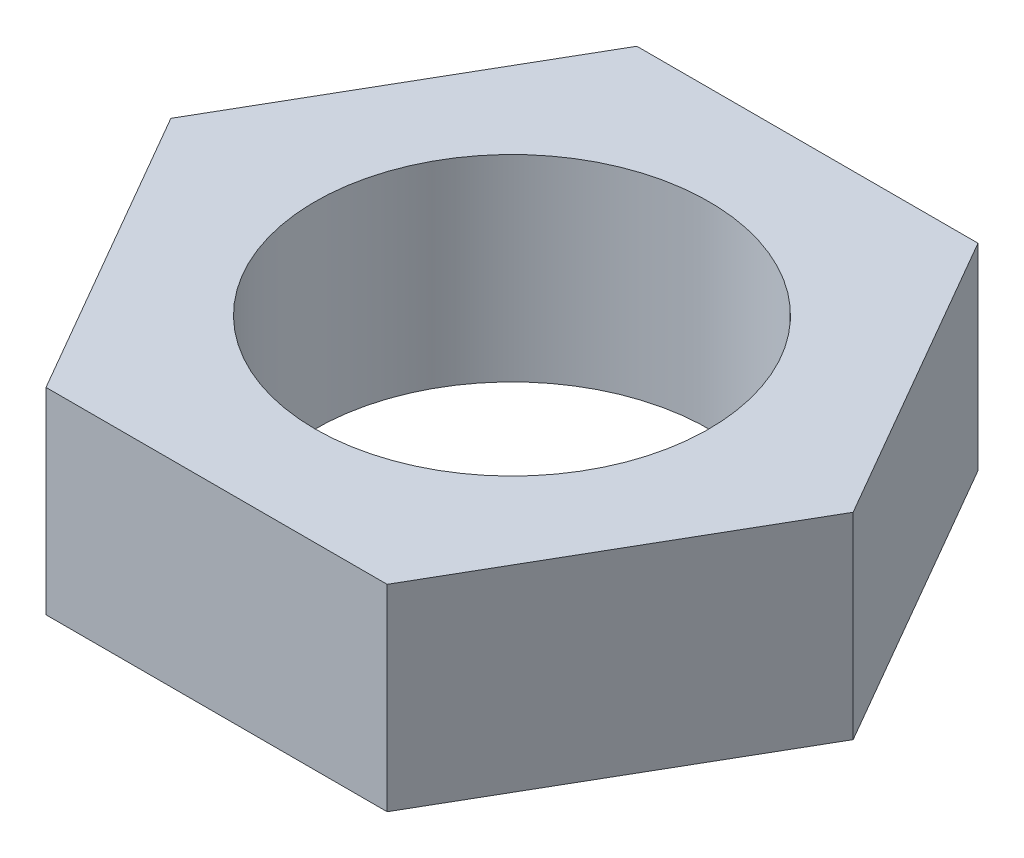
ISO-10303-21;
HEADER;
FILE_DESCRIPTION(('STEP AP214'),'2;1');
FILE_NAME('part.step','',(''),(''),'','','');
FILE_SCHEMA(('AUTOMOTIVE_DESIGN { 1 0 10303 214 1 1 1 1 }'));
ENDSEC;
DATA;
#1=APPLICATION_CONTEXT('core data for automotive mechanical design processes');
#2=APPLICATION_PROTOCOL_DEFINITION('international standard','automotive_design',2000,#1);
#3=PRODUCT_CONTEXT('',#1,'mechanical');
#4=PRODUCT('Part','Part','',(#3));
#5=PRODUCT_RELATED_PRODUCT_CATEGORY('part','',(#4));
#6=PRODUCT_DEFINITION_FORMATION('','',#4);
#7=PRODUCT_DEFINITION_CONTEXT('part definition',#1,'design');
#8=PRODUCT_DEFINITION('design','',#6,#7);
#9=PRODUCT_DEFINITION_SHAPE('','',#8);
#10=(LENGTH_UNIT() NAMED_UNIT(*) SI_UNIT(.MILLI.,.METRE.));
#11=(NAMED_UNIT(*) PLANE_ANGLE_UNIT() SI_UNIT($,.RADIAN.));
#12=(NAMED_UNIT(*) SI_UNIT($,.STERADIAN.) SOLID_ANGLE_UNIT());
#13=UNCERTAINTY_MEASURE_WITH_UNIT(LENGTH_MEASURE(1.E-05),#10,'distance_accuracy_value','');
#14=(GEOMETRIC_REPRESENTATION_CONTEXT(3) GLOBAL_UNCERTAINTY_ASSIGNED_CONTEXT((#13)) GLOBAL_UNIT_ASSIGNED_CONTEXT((#10,
#11,#12)) REPRESENTATION_CONTEXT('',''));
#15=CARTESIAN_POINT('',(0.,0.,0.));
#16=DIRECTION('',(0.,0.,1.));
#17=DIRECTION('',(1.,0.,0.));
#18=AXIS2_PLACEMENT_3D('',#15,#16,#17);
#19=CARTESIAN_POINT('',(0.,5.,0.));
#20=DIRECTION('',(0.,1.,0.));
#21=DIRECTION('',(0.,0.,1.));
#22=AXIS2_PLACEMENT_3D('',#19,#20,#21);
#23=PLANE('',#22);
#24=DIRECTION('',(0.499999999999995,0.,-0.866025403784441));
#25=VECTOR('',#24,1.);
#26=CARTESIAN_POINT('',(4.33012701892229,5.,7.49999999999996));
#27=LINE('',#26,#25);
#28=CARTESIAN_POINT('',(4.33012701892229,5.,7.49999999999996));
#29=VERTEX_POINT('',#28);
#30=CARTESIAN_POINT('',(8.66025403784439,5.,0.));
#31=VERTEX_POINT('',#30);
#32=EDGE_CURVE('E129',#29,#31,#27,.T.);
#33=ORIENTED_EDGE('',*,*,#32,.T.);
#34=DIRECTION('',(-0.500000000000001,0.,-0.866025403784438));
#35=VECTOR('',#34,1.);
#36=CARTESIAN_POINT('',(8.66025403784439,5.,0.));
#37=LINE('',#36,#35);
#38=CARTESIAN_POINT('',(4.33012701892218,5.,-7.50000000000002));
#39=VERTEX_POINT('',#38);
#40=EDGE_CURVE('E87',#31,#39,#37,.T.);
#41=ORIENTED_EDGE('',*,*,#40,.T.);
#42=DIRECTION('',(-1.,0.,0.));
#43=VECTOR('',#42,1.);
#44=CARTESIAN_POINT('',(4.33012701892218,5.,-7.50000000000002));
#45=LINE('',#44,#43);
#46=CARTESIAN_POINT('',(-4.33012701892223,5.,-7.49999999999999));
#47=VERTEX_POINT('',#46);
#48=EDGE_CURVE('E100',#39,#47,#45,.T.);
#49=ORIENTED_EDGE('',*,*,#48,.T.);
#50=DIRECTION('',(-0.499999999999995,0.,0.866025403784442));
#51=VECTOR('',#50,1.);
#52=CARTESIAN_POINT('',(-4.33012701892223,5.,-7.49999999999999));
#53=LINE('',#52,#51);
#54=CARTESIAN_POINT('',(-8.66025403784439,5.,0.));
#55=VERTEX_POINT('',#54);
#56=EDGE_CURVE('E94',#47,#55,#53,.T.);
#57=ORIENTED_EDGE('',*,*,#56,.T.);
#58=DIRECTION('',(0.500000000000007,0.,0.866025403784434));
#59=VECTOR('',#58,1.);
#60=CARTESIAN_POINT('',(-8.66025403784439,5.,0.));
#61=LINE('',#60,#59);
#62=CARTESIAN_POINT('',(-4.33012701892213,5.,7.50000000000005));
#63=VERTEX_POINT('',#62);
#64=EDGE_CURVE('E98',#55,#63,#61,.T.);
#65=ORIENTED_EDGE('',*,*,#64,.T.);
#66=DIRECTION('',(1.,0.,0.));
#67=VECTOR('',#66,1.);
#68=CARTESIAN_POINT('',(-4.33012701892213,5.,7.50000000000005));
#69=LINE('',#68,#67);
#70=EDGE_CURVE('E50',#63,#29,#69,.T.);
#71=ORIENTED_EDGE('',*,*,#70,.T.);
#72=EDGE_LOOP('',(#33,#41,#49,#57,#65,#71));
#73=FACE_BOUND('',#72,.T.);
#74=CARTESIAN_POINT('',(0.,5.,0.));
#75=DIRECTION('',(0.,1.,0.));
#76=DIRECTION('',(0.,0.,1.));
#77=AXIS2_PLACEMENT_3D('',#74,#75,#76);
#78=CIRCLE('',#77,5.);
#79=CARTESIAN_POINT('',(0.,5.,5.));
#80=VERTEX_POINT('',#79);
#81=EDGE_CURVE('E122',#80,#80,#78,.T.);
#82=ORIENTED_EDGE('',*,*,#81,.F.);
#83=EDGE_LOOP('',(#82));
#84=FACE_BOUND('',#83,.T.);
#85=ADVANCED_FACE('F33',(#73,#84),#23,.T.);
#86=CARTESIAN_POINT('',(0.,0.,0.));
#87=DIRECTION('',(0.,1.,0.));
#88=DIRECTION('',(0.,0.,1.));
#89=AXIS2_PLACEMENT_3D('',#86,#87,#88);
#90=PLANE('',#89);
#91=DIRECTION('',(0.499999999999995,0.,-0.866025403784441));
#92=VECTOR('',#91,1.);
#93=CARTESIAN_POINT('',(4.33012701892229,0.,7.49999999999996));
#94=LINE('',#93,#92);
#95=CARTESIAN_POINT('',(4.33012701892229,0.,7.49999999999996));
#96=VERTEX_POINT('',#95);
#97=CARTESIAN_POINT('',(8.66025403784439,0.,0.));
#98=VERTEX_POINT('',#97);
#99=EDGE_CURVE('E118',#96,#98,#94,.T.);
#100=ORIENTED_EDGE('',*,*,#99,.F.);
#101=DIRECTION('',(1.,0.,0.));
#102=VECTOR('',#101,1.);
#103=CARTESIAN_POINT('',(-4.33012701892213,0.,7.50000000000005));
#104=LINE('',#103,#102);
#105=CARTESIAN_POINT('',(-4.33012701892213,0.,7.50000000000005));
#106=VERTEX_POINT('',#105);
#107=EDGE_CURVE('E79',#106,#96,#104,.T.);
#108=ORIENTED_EDGE('',*,*,#107,.F.);
#109=DIRECTION('',(0.500000000000007,0.,0.866025403784434));
#110=VECTOR('',#109,1.);
#111=CARTESIAN_POINT('',(-8.66025403784439,0.,0.));
#112=LINE('',#111,#110);
#113=CARTESIAN_POINT('',(-8.66025403784439,0.,0.));
#114=VERTEX_POINT('',#113);
#115=EDGE_CURVE('E73',#114,#106,#112,.T.);
#116=ORIENTED_EDGE('',*,*,#115,.F.);
#117=DIRECTION('',(-0.499999999999995,0.,0.866025403784442));
#118=VECTOR('',#117,1.);
#119=CARTESIAN_POINT('',(-4.33012701892223,0.,-7.49999999999999));
#120=LINE('',#119,#118);
#121=CARTESIAN_POINT('',(-4.33012701892223,0.,-7.49999999999999));
#122=VERTEX_POINT('',#121);
#123=EDGE_CURVE('E108',#122,#114,#120,.T.);
#124=ORIENTED_EDGE('',*,*,#123,.F.);
#125=DIRECTION('',(-1.,0.,0.));
#126=VECTOR('',#125,1.);
#127=CARTESIAN_POINT('',(4.33012701892218,0.,-7.50000000000002));
#128=LINE('',#127,#126);
#129=CARTESIAN_POINT('',(4.33012701892218,0.,-7.50000000000002));
#130=VERTEX_POINT('',#129);
#131=EDGE_CURVE('E124',#130,#122,#128,.T.);
#132=ORIENTED_EDGE('',*,*,#131,.F.);
#133=DIRECTION('',(-0.500000000000001,0.,-0.866025403784438));
#134=VECTOR('',#133,1.);
#135=CARTESIAN_POINT('',(8.66025403784439,0.,0.));
#136=LINE('',#135,#134);
#137=EDGE_CURVE('E121',#98,#130,#136,.T.);
#138=ORIENTED_EDGE('',*,*,#137,.F.);
#139=EDGE_LOOP('',(#100,#108,#116,#124,#132,#138));
#140=FACE_BOUND('',#139,.T.);
#141=CARTESIAN_POINT('',(0.,0.,0.));
#142=DIRECTION('',(0.,1.,0.));
#143=DIRECTION('',(0.,0.,1.));
#144=AXIS2_PLACEMENT_3D('',#141,#142,#143);
#145=CIRCLE('',#144,5.);
#146=CARTESIAN_POINT('',(0.,0.,5.));
#147=VERTEX_POINT('',#146);
#148=EDGE_CURVE('E222',#147,#147,#145,.T.);
#149=ORIENTED_EDGE('',*,*,#148,.T.);
#150=EDGE_LOOP('',(#149));
#151=FACE_BOUND('',#150,.T.);
#152=ADVANCED_FACE('F138',(#140,#151),#90,.F.);
#153=CARTESIAN_POINT('',(4.33012701892229,5.,7.49999999999996));
#154=DIRECTION('',(-0.866025403784442,0.,-0.499999999999995));
#155=DIRECTION('',(-0.499999999999995,0.,0.866025403784442));
#156=AXIS2_PLACEMENT_3D('',#153,#154,#155);
#157=PLANE('',#156);
#158=ORIENTED_EDGE('',*,*,#99,.T.);
#159=DIRECTION('',(0.,-1.,0.));
#160=VECTOR('',#159,1.);
#161=CARTESIAN_POINT('',(8.66025403784439,5.,0.));
#162=LINE('',#161,#160);
#163=EDGE_CURVE('E11',#31,#98,#162,.T.);
#164=ORIENTED_EDGE('',*,*,#163,.F.);
#165=ORIENTED_EDGE('',*,*,#32,.F.);
#166=DIRECTION('',(0.,-1.,0.));
#167=VECTOR('',#166,1.);
#168=CARTESIAN_POINT('',(4.33012701892229,5.,7.49999999999996));
#169=LINE('',#168,#167);
#170=EDGE_CURVE('E114',#29,#96,#169,.T.);
#171=ORIENTED_EDGE('',*,*,#170,.T.);
#172=EDGE_LOOP('',(#158,#164,#165,#171));
#173=FACE_BOUND('',#172,.T.);
#174=ADVANCED_FACE('F35',(#173),#157,.F.);
#175=CARTESIAN_POINT('',(8.66025403784439,5.,0.));
#176=DIRECTION('',(-0.866025403784438,0.,0.500000000000001));
#177=DIRECTION('',(0.500000000000001,0.,0.866025403784438));
#178=AXIS2_PLACEMENT_3D('',#175,#176,#177);
#179=PLANE('',#178);
#180=ORIENTED_EDGE('',*,*,#137,.T.);
#181=DIRECTION('',(0.,-1.,0.));
#182=VECTOR('',#181,1.);
#183=CARTESIAN_POINT('',(4.33012701892218,5.,-7.50000000000002));
#184=LINE('',#183,#182);
#185=EDGE_CURVE('E42',#39,#130,#184,.T.);
#186=ORIENTED_EDGE('',*,*,#185,.F.);
#187=ORIENTED_EDGE('',*,*,#40,.F.);
#188=ORIENTED_EDGE('',*,*,#163,.T.);
#189=EDGE_LOOP('',(#180,#186,#187,#188));
#190=FACE_BOUND('',#189,.T.);
#191=ADVANCED_FACE('F163',(#190),#179,.F.);
#192=CARTESIAN_POINT('',(4.33012701892218,5.,-7.50000000000002));
#193=DIRECTION('',(0.,0.,1.));
#194=DIRECTION('',(1.,0.,0.));
#195=AXIS2_PLACEMENT_3D('',#192,#193,#194);
#196=PLANE('',#195);
#197=ORIENTED_EDGE('',*,*,#131,.T.);
#198=DIRECTION('',(0.,-1.,0.));
#199=VECTOR('',#198,1.);
#200=CARTESIAN_POINT('',(-4.33012701892223,5.,-7.49999999999999));
#201=LINE('',#200,#199);
#202=EDGE_CURVE('E109',#47,#122,#201,.T.);
#203=ORIENTED_EDGE('',*,*,#202,.F.);
#204=ORIENTED_EDGE('',*,*,#48,.F.);
#205=ORIENTED_EDGE('',*,*,#185,.T.);
#206=EDGE_LOOP('',(#197,#203,#204,#205));
#207=FACE_BOUND('',#206,.T.);
#208=ADVANCED_FACE('F135',(#207),#196,.F.);
#209=CARTESIAN_POINT('',(-4.33012701892223,5.,-7.49999999999999));
#210=DIRECTION('',(0.866025403784442,0.,0.499999999999995));
#211=DIRECTION('',(0.499999999999995,0.,-0.866025403784442));
#212=AXIS2_PLACEMENT_3D('',#209,#210,#211);
#213=PLANE('',#212);
#214=ORIENTED_EDGE('',*,*,#123,.T.);
#215=DIRECTION('',(0.,-1.,0.));
#216=VECTOR('',#215,1.);
#217=CARTESIAN_POINT('',(-8.66025403784439,5.,0.));
#218=LINE('',#217,#216);
#219=EDGE_CURVE('E105',#55,#114,#218,.T.);
#220=ORIENTED_EDGE('',*,*,#219,.F.);
#221=ORIENTED_EDGE('',*,*,#56,.F.);
#222=ORIENTED_EDGE('',*,*,#202,.T.);
#223=EDGE_LOOP('',(#214,#220,#221,#222));
#224=FACE_BOUND('',#223,.T.);
#225=ADVANCED_FACE('F106',(#224),#213,.F.);
#226=CARTESIAN_POINT('',(-8.66025403784439,5.,0.));
#227=DIRECTION('',(0.866025403784435,0.,-0.500000000000007));
#228=DIRECTION('',(-0.500000000000007,0.,-0.866025403784435));
#229=AXIS2_PLACEMENT_3D('',#226,#227,#228);
#230=PLANE('',#229);
#231=ORIENTED_EDGE('',*,*,#115,.T.);
#232=DIRECTION('',(0.,-1.,0.));
#233=VECTOR('',#232,1.);
#234=CARTESIAN_POINT('',(-4.33012701892213,5.,7.50000000000005));
#235=LINE('',#234,#233);
#236=EDGE_CURVE('E110',#63,#106,#235,.T.);
#237=ORIENTED_EDGE('',*,*,#236,.F.);
#238=ORIENTED_EDGE('',*,*,#64,.F.);
#239=ORIENTED_EDGE('',*,*,#219,.T.);
#240=EDGE_LOOP('',(#231,#237,#238,#239));
#241=FACE_BOUND('',#240,.T.);
#242=ADVANCED_FACE('F112',(#241),#230,.F.);
#243=CARTESIAN_POINT('',(-4.33012701892213,5.,7.50000000000005));
#244=DIRECTION('',(0.,0.,-1.));
#245=DIRECTION('',(-1.,0.,0.));
#246=AXIS2_PLACEMENT_3D('',#243,#244,#245);
#247=PLANE('',#246);
#248=ORIENTED_EDGE('',*,*,#107,.T.);
#249=ORIENTED_EDGE('',*,*,#170,.F.);
#250=ORIENTED_EDGE('',*,*,#70,.F.);
#251=ORIENTED_EDGE('',*,*,#236,.T.);
#252=EDGE_LOOP('',(#248,#249,#250,#251));
#253=FACE_BOUND('',#252,.T.);
#254=ADVANCED_FACE('F143',(#253),#247,.F.);
#255=CARTESIAN_POINT('',(0.,5.,0.));
#256=DIRECTION('',(0.,-1.,0.));
#257=DIRECTION('',(0.,0.,-1.));
#258=AXIS2_PLACEMENT_3D('',#255,#256,#257);
#259=CYLINDRICAL_SURFACE('',#258,5.);
#260=ORIENTED_EDGE('',*,*,#81,.T.);
#261=EDGE_LOOP('',(#260));
#262=FACE_BOUND('',#261,.T.);
#263=ORIENTED_EDGE('',*,*,#148,.F.);
#264=EDGE_LOOP('',(#263));
#265=FACE_BOUND('',#264,.T.);
#266=ADVANCED_FACE('F145',(#262,#265),#259,.F.);
#267=CLOSED_SHELL('',(#85,#152,#174,#191,#208,#225,#242,#254,#266));
#268=MANIFOLD_SOLID_BREP('B2',#267);
#269=ADVANCED_BREP_SHAPE_REPRESENTATION('',(#18,#268),#14);
#270=SHAPE_DEFINITION_REPRESENTATION(#9,#269);
ENDSEC;
END-ISO-10303-21;
